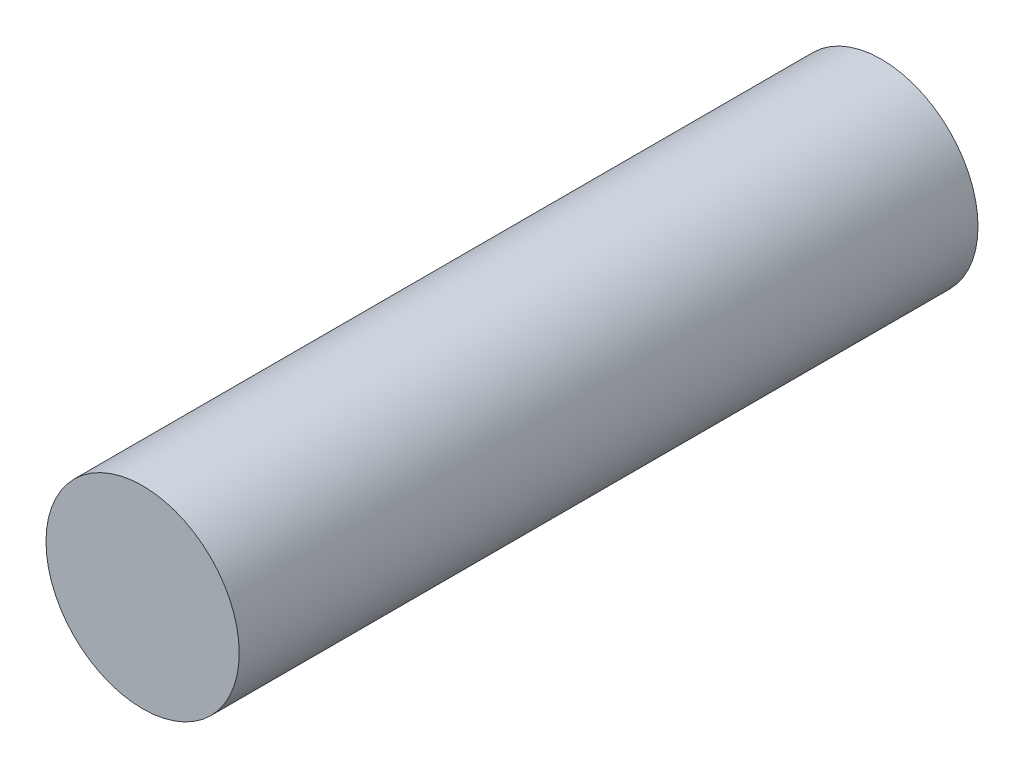
ISO-10303-21;
HEADER;
FILE_DESCRIPTION(('STEP AP214'),'2;1');
FILE_NAME('part.step','',(''),(''),'','','');
FILE_SCHEMA(('AUTOMOTIVE_DESIGN { 1 0 10303 214 1 1 1 1 }'));
ENDSEC;
DATA;
#1=APPLICATION_CONTEXT('core data for automotive mechanical design processes');
#2=APPLICATION_PROTOCOL_DEFINITION('international standard','automotive_design',2000,#1);
#3=PRODUCT_CONTEXT('',#1,'mechanical');
#4=PRODUCT('Part','Part','',(#3));
#5=PRODUCT_RELATED_PRODUCT_CATEGORY('part','',(#4));
#6=PRODUCT_DEFINITION_FORMATION('','',#4);
#7=PRODUCT_DEFINITION_CONTEXT('part definition',#1,'design');
#8=PRODUCT_DEFINITION('design','',#6,#7);
#9=PRODUCT_DEFINITION_SHAPE('','',#8);
#10=(LENGTH_UNIT() NAMED_UNIT(*) SI_UNIT(.MILLI.,.METRE.));
#11=(NAMED_UNIT(*) PLANE_ANGLE_UNIT() SI_UNIT($,.RADIAN.));
#12=(NAMED_UNIT(*) SI_UNIT($,.STERADIAN.) SOLID_ANGLE_UNIT());
#13=UNCERTAINTY_MEASURE_WITH_UNIT(LENGTH_MEASURE(1.E-05),#10,'distance_accuracy_value','');
#14=(GEOMETRIC_REPRESENTATION_CONTEXT(3) GLOBAL_UNCERTAINTY_ASSIGNED_CONTEXT((#13)) GLOBAL_UNIT_ASSIGNED_CONTEXT((#10,
#11,#12)) REPRESENTATION_CONTEXT('',''));
#15=CARTESIAN_POINT('',(0.,0.,0.));
#16=DIRECTION('',(0.,0.,1.));
#17=DIRECTION('',(1.,0.,0.));
#18=AXIS2_PLACEMENT_3D('',#15,#16,#17);
#19=CARTESIAN_POINT('',(0.,0.,-65.));
#20=DIRECTION('',(0.,0.,1.));
#21=DIRECTION('',(1.,0.,0.));
#22=AXIS2_PLACEMENT_3D('',#19,#20,#21);
#23=CYLINDRICAL_SURFACE('',#22,8.5);
#24=CARTESIAN_POINT('',(0.,0.,-65.));
#25=DIRECTION('',(0.,0.,1.));
#26=DIRECTION('',(1.,0.,0.));
#27=AXIS2_PLACEMENT_3D('',#24,#25,#26);
#28=CIRCLE('',#27,8.5);
#29=CARTESIAN_POINT('',(8.5,0.,-65.));
#30=VERTEX_POINT('',#29);
#31=EDGE_CURVE('E10',#30,#30,#28,.T.);
#32=ORIENTED_EDGE('',*,*,#31,.T.);
#33=EDGE_LOOP('',(#32));
#34=FACE_BOUND('',#33,.T.);
#35=CARTESIAN_POINT('',(0.,0.,0.));
#36=DIRECTION('',(0.,0.,1.));
#37=DIRECTION('',(1.,0.,0.));
#38=AXIS2_PLACEMENT_3D('',#35,#36,#37);
#39=CIRCLE('',#38,8.5);
#40=CARTESIAN_POINT('',(8.5,0.,0.));
#41=VERTEX_POINT('',#40);
#42=EDGE_CURVE('E37',#41,#41,#39,.T.);
#43=ORIENTED_EDGE('',*,*,#42,.F.);
#44=EDGE_LOOP('',(#43));
#45=FACE_BOUND('',#44,.T.);
#46=ADVANCED_FACE('F40',(#34,#45),#23,.T.);
#47=CARTESIAN_POINT('',(0.,0.,-65.));
#48=DIRECTION('',(0.,0.,1.));
#49=DIRECTION('',(1.,0.,0.));
#50=AXIS2_PLACEMENT_3D('',#47,#48,#49);
#51=PLANE('',#50);
#52=ORIENTED_EDGE('',*,*,#31,.F.);
#53=EDGE_LOOP('',(#52));
#54=FACE_BOUND('',#53,.T.);
#55=ADVANCED_FACE('F55',(#54),#51,.F.);
#56=CARTESIAN_POINT('',(0.,0.,0.));
#57=DIRECTION('',(0.,0.,1.));
#58=DIRECTION('',(1.,0.,0.));
#59=AXIS2_PLACEMENT_3D('',#56,#57,#58);
#60=PLANE('',#59);
#61=ORIENTED_EDGE('',*,*,#42,.T.);
#62=EDGE_LOOP('',(#61));
#63=FACE_BOUND('',#62,.T.);
#64=ADVANCED_FACE('F47',(#63),#60,.T.);
#65=CLOSED_SHELL('',(#46,#55,#64));
#66=MANIFOLD_SOLID_BREP('B2',#65);
#67=ADVANCED_BREP_SHAPE_REPRESENTATION('',(#18,#66),#14);
#68=SHAPE_DEFINITION_REPRESENTATION(#9,#67);
ENDSEC;
END-ISO-10303-21;
